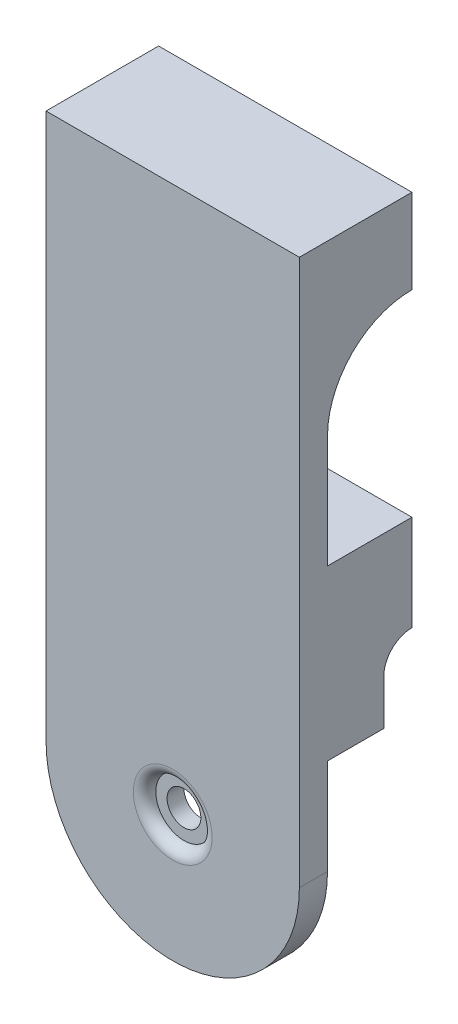
ISO-10303-21;
HEADER;
FILE_DESCRIPTION(('STEP AP214'),'2;1');
FILE_NAME('part.step','',(''),(''),'','','');
FILE_SCHEMA(('AUTOMOTIVE_DESIGN { 1 0 10303 214 1 1 1 1 }'));
ENDSEC;
DATA;
#1=APPLICATION_CONTEXT('core data for automotive mechanical design processes');
#2=APPLICATION_PROTOCOL_DEFINITION('international standard','automotive_design',2000,#1);
#3=PRODUCT_CONTEXT('',#1,'mechanical');
#4=PRODUCT('Part','Part','',(#3));
#5=PRODUCT_RELATED_PRODUCT_CATEGORY('part','',(#4));
#6=PRODUCT_DEFINITION_FORMATION('','',#4);
#7=PRODUCT_DEFINITION_CONTEXT('part definition',#1,'design');
#8=PRODUCT_DEFINITION('design','',#6,#7);
#9=PRODUCT_DEFINITION_SHAPE('','',#8);
#10=(LENGTH_UNIT() NAMED_UNIT(*) SI_UNIT(.MILLI.,.METRE.));
#11=(NAMED_UNIT(*) PLANE_ANGLE_UNIT() SI_UNIT($,.RADIAN.));
#12=(NAMED_UNIT(*) SI_UNIT($,.STERADIAN.) SOLID_ANGLE_UNIT());
#13=UNCERTAINTY_MEASURE_WITH_UNIT(LENGTH_MEASURE(1.E-05),#10,'distance_accuracy_value','');
#14=(GEOMETRIC_REPRESENTATION_CONTEXT(3) GLOBAL_UNCERTAINTY_ASSIGNED_CONTEXT((#13)) GLOBAL_UNIT_ASSIGNED_CONTEXT((#10,
#11,#12)) REPRESENTATION_CONTEXT('',''));
#15=CARTESIAN_POINT('',(0.,0.,0.));
#16=DIRECTION('',(0.,0.,1.));
#17=DIRECTION('',(1.,0.,0.));
#18=AXIS2_PLACEMENT_3D('',#15,#16,#17);
#19=CARTESIAN_POINT('',(-22.5,97.,0.));
#20=DIRECTION('',(0.,0.,1.));
#21=DIRECTION('',(1.,0.,0.));
#22=AXIS2_PLACEMENT_3D('',#19,#20,#21);
#23=PLANE('',#22);
#24=DIRECTION('',(0.,-1.,0.));
#25=VECTOR('',#24,1.);
#26=CARTESIAN_POINT('',(-22.5,97.,0.));
#27=LINE('',#26,#25);
#28=CARTESIAN_POINT('',(-22.5,67.,0.));
#29=VERTEX_POINT('',#28);
#30=CARTESIAN_POINT('',(-22.5,47.,0.));
#31=VERTEX_POINT('',#30);
#32=EDGE_CURVE('E239',#29,#31,#27,.T.);
#33=ORIENTED_EDGE('',*,*,#32,.F.);
#34=DIRECTION('',(-1.,0.,0.));
#35=VECTOR('',#34,1.);
#36=CARTESIAN_POINT('',(22.5,67.,0.));
#37=LINE('',#36,#35);
#38=CARTESIAN_POINT('',(22.5,67.,0.));
#39=VERTEX_POINT('',#38);
#40=EDGE_CURVE('E61',#29,#39,#37,.F.);
#41=ORIENTED_EDGE('',*,*,#40,.T.);
#42=DIRECTION('',(0.,-1.,0.));
#43=VECTOR('',#42,1.);
#44=CARTESIAN_POINT('',(22.5,97.,0.));
#45=LINE('',#44,#43);
#46=CARTESIAN_POINT('',(22.5,47.,0.));
#47=VERTEX_POINT('',#46);
#48=EDGE_CURVE('E243',#39,#47,#45,.T.);
#49=ORIENTED_EDGE('',*,*,#48,.T.);
#50=DIRECTION('',(-1.,0.,0.));
#51=VECTOR('',#50,1.);
#52=CARTESIAN_POINT('',(-22.5,47.,0.));
#53=LINE('',#52,#51);
#54=EDGE_CURVE('E230',#47,#31,#53,.T.);
#55=ORIENTED_EDGE('',*,*,#54,.T.);
#56=EDGE_LOOP('',(#33,#41,#49,#55));
#57=FACE_BOUND('',#56,.T.);
#58=ADVANCED_FACE('F39',(#57),#23,.F.);
#59=CARTESIAN_POINT('',(0.,47.,0.));
#60=DIRECTION('',(0.,-1.,0.));
#61=DIRECTION('',(0.,0.,-1.));
#62=AXIS2_PLACEMENT_3D('',#59,#60,#61);
#63=PLANE('',#62);
#64=ORIENTED_EDGE('',*,*,#54,.F.);
#65=DIRECTION('',(0.,0.,-1.));
#66=VECTOR('',#65,1.);
#67=CARTESIAN_POINT('',(22.5,47.,-15.));
#68=LINE('',#67,#66);
#69=CARTESIAN_POINT('',(22.5,47.,-15.));
#70=VERTEX_POINT('',#69);
#71=EDGE_CURVE('E279',#47,#70,#68,.T.);
#72=ORIENTED_EDGE('',*,*,#71,.T.);
#73=DIRECTION('',(-1.,0.,0.));
#74=VECTOR('',#73,1.);
#75=CARTESIAN_POINT('',(-22.5,47.,-15.));
#76=LINE('',#75,#74);
#77=CARTESIAN_POINT('',(-22.5,47.,-15.));
#78=VERTEX_POINT('',#77);
#79=EDGE_CURVE('E281',#70,#78,#76,.T.);
#80=ORIENTED_EDGE('',*,*,#79,.T.);
#81=DIRECTION('',(0.,0.,1.));
#82=VECTOR('',#81,1.);
#83=CARTESIAN_POINT('',(-22.5,47.,5.));
#84=LINE('',#83,#82);
#85=EDGE_CURVE('E283',#78,#31,#84,.T.);
#86=ORIENTED_EDGE('',*,*,#85,.T.);
#87=EDGE_LOOP('',(#64,#72,#80,#86));
#88=FACE_BOUND('',#87,.T.);
#89=ADVANCED_FACE('F371',(#88),#63,.F.);
#90=CARTESIAN_POINT('',(-22.5,47.,-15.));
#91=DIRECTION('',(0.,0.,1.));
#92=DIRECTION('',(1.,0.,0.));
#93=AXIS2_PLACEMENT_3D('',#90,#91,#92);
#94=PLANE('',#93);
#95=DIRECTION('',(-1.,0.,0.));
#96=VECTOR('',#95,1.);
#97=CARTESIAN_POINT('',(-22.5,30.,-15.));
#98=LINE('',#97,#96);
#99=CARTESIAN_POINT('',(22.5,30.,-15.));
#100=VERTEX_POINT('',#99);
#101=CARTESIAN_POINT('',(-22.5,30.,-15.));
#102=VERTEX_POINT('',#101);
#103=EDGE_CURVE('E278',#100,#102,#98,.T.);
#104=ORIENTED_EDGE('',*,*,#103,.T.);
#105=DIRECTION('',(0.,-1.,0.));
#106=VECTOR('',#105,1.);
#107=CARTESIAN_POINT('',(-22.5,47.,-15.));
#108=LINE('',#107,#106);
#109=EDGE_CURVE('E286',#78,#102,#108,.T.);
#110=ORIENTED_EDGE('',*,*,#109,.F.);
#111=ORIENTED_EDGE('',*,*,#79,.F.);
#112=DIRECTION('',(0.,-1.,0.));
#113=VECTOR('',#112,1.);
#114=CARTESIAN_POINT('',(22.5,47.,-15.));
#115=LINE('',#114,#113);
#116=EDGE_CURVE('E290',#70,#100,#115,.T.);
#117=ORIENTED_EDGE('',*,*,#116,.T.);
#118=EDGE_LOOP('',(#104,#110,#111,#117));
#119=FACE_BOUND('',#118,.T.);
#120=DIRECTION('',(-1.,0.,0.));
#121=VECTOR('',#120,1.);
#122=CARTESIAN_POINT('',(15.25,41.75,-15.));
#123=LINE('',#122,#121);
#124=CARTESIAN_POINT('',(15.25,41.75,-15.));
#125=VERTEX_POINT('',#124);
#126=CARTESIAN_POINT('',(-15.25,41.75,-15.));
#127=VERTEX_POINT('',#126);
#128=EDGE_CURVE('E245',#125,#127,#123,.T.);
#129=ORIENTED_EDGE('',*,*,#128,.T.);
#130=DIRECTION('',(0.,-1.,0.));
#131=VECTOR('',#130,1.);
#132=CARTESIAN_POINT('',(-15.25,41.75,-15.));
#133=LINE('',#132,#131);
#134=CARTESIAN_POINT('',(-15.25,35.25,-15.));
#135=VERTEX_POINT('',#134);
#136=EDGE_CURVE('E261',#127,#135,#133,.T.);
#137=ORIENTED_EDGE('',*,*,#136,.T.);
#138=DIRECTION('',(-1.,0.,0.));
#139=VECTOR('',#138,1.);
#140=CARTESIAN_POINT('',(15.25,35.25,-15.));
#141=LINE('',#140,#139);
#142=CARTESIAN_POINT('',(15.25,35.25,-15.));
#143=VERTEX_POINT('',#142);
#144=EDGE_CURVE('E264',#143,#135,#141,.T.);
#145=ORIENTED_EDGE('',*,*,#144,.F.);
#146=DIRECTION('',(0.,-1.,0.));
#147=VECTOR('',#146,1.);
#148=CARTESIAN_POINT('',(15.25,41.75,-15.));
#149=LINE('',#148,#147);
#150=EDGE_CURVE('E250',#125,#143,#149,.T.);
#151=ORIENTED_EDGE('',*,*,#150,.F.);
#152=EDGE_LOOP('',(#129,#137,#145,#151));
#153=FACE_BOUND('',#152,.T.);
#154=ADVANCED_FACE('F377',(#119,#153),#94,.F.);
#155=CARTESIAN_POINT('',(0.,0.,0.));
#156=DIRECTION('',(0.,0.,1.));
#157=DIRECTION('',(1.,0.,0.));
#158=AXIS2_PLACEMENT_3D('',#155,#156,#157);
#159=PLANE('',#158);
#160=CARTESIAN_POINT('',(0.,0.,0.));
#161=DIRECTION('',(0.,0.,1.));
#162=DIRECTION('',(1.,0.,0.));
#163=AXIS2_PLACEMENT_3D('',#160,#161,#162);
#164=CIRCLE('',#163,3.);
#165=CARTESIAN_POINT('',(3.,0.,0.));
#166=VERTEX_POINT('',#165);
#167=EDGE_CURVE('E313',#166,#166,#164,.T.);
#168=ORIENTED_EDGE('',*,*,#167,.T.);
#169=EDGE_LOOP('',(#168));
#170=FACE_BOUND('',#169,.T.);
#171=DIRECTION('',(-1.,0.,0.));
#172=VECTOR('',#171,1.);
#173=CARTESIAN_POINT('',(22.5,17.,0.));
#174=LINE('',#173,#172);
#175=CARTESIAN_POINT('',(22.5,17.,0.));
#176=VERTEX_POINT('',#175);
#177=CARTESIAN_POINT('',(-22.5,17.,0.));
#178=VERTEX_POINT('',#177);
#179=EDGE_CURVE('E293',#176,#178,#174,.T.);
#180=ORIENTED_EDGE('',*,*,#179,.F.);
#181=DIRECTION('',(0.,1.,0.));
#182=VECTOR('',#181,1.);
#183=CARTESIAN_POINT('',(22.5,30.,0.));
#184=LINE('',#183,#182);
#185=CARTESIAN_POINT('',(22.5,0.,0.));
#186=VERTEX_POINT('',#185);
#187=EDGE_CURVE('E328',#186,#176,#184,.T.);
#188=ORIENTED_EDGE('',*,*,#187,.F.);
#189=CARTESIAN_POINT('',(0.,0.,0.));
#190=DIRECTION('',(0.,0.,1.));
#191=DIRECTION('',(1.,0.,0.));
#192=AXIS2_PLACEMENT_3D('',#189,#190,#191);
#193=CIRCLE('',#192,22.5);
#194=CARTESIAN_POINT('',(-22.5,0.,0.));
#195=VERTEX_POINT('',#194);
#196=EDGE_CURVE('E316',#195,#186,#193,.T.);
#197=ORIENTED_EDGE('',*,*,#196,.F.);
#198=DIRECTION('',(0.,-1.,0.));
#199=VECTOR('',#198,1.);
#200=CARTESIAN_POINT('',(-22.5,0.,0.));
#201=LINE('',#200,#199);
#202=EDGE_CURVE('E321',#178,#195,#201,.T.);
#203=ORIENTED_EDGE('',*,*,#202,.F.);
#204=EDGE_LOOP('',(#180,#188,#197,#203));
#205=FACE_BOUND('',#204,.T.);
#206=ADVANCED_FACE('F407',(#170,#205),#159,.F.);
#207=CARTESIAN_POINT('',(0.,0.,5.));
#208=DIRECTION('',(0.,0.,-1.));
#209=DIRECTION('',(-1.,0.,0.));
#210=AXIS2_PLACEMENT_3D('',#207,#208,#209);
#211=CYLINDRICAL_SURFACE('',#210,3.);
#212=ORIENTED_EDGE('',*,*,#167,.F.);
#213=EDGE_LOOP('',(#212));
#214=FACE_BOUND('',#213,.T.);
#215=CARTESIAN_POINT('',(0.,0.,3.));
#216=DIRECTION('',(0.,0.,1.));
#217=DIRECTION('',(1.,0.,0.));
#218=AXIS2_PLACEMENT_3D('',#215,#216,#217);
#219=CIRCLE('',#218,3.);
#220=CARTESIAN_POINT('',(3.,0.,3.));
#221=VERTEX_POINT('',#220);
#222=EDGE_CURVE('E312',#221,#221,#219,.T.);
#223=ORIENTED_EDGE('',*,*,#222,.T.);
#224=EDGE_LOOP('',(#223));
#225=FACE_BOUND('',#224,.T.);
#226=ADVANCED_FACE('F421',(#214,#225),#211,.F.);
#227=CARTESIAN_POINT('',(0.,0.,5.));
#228=DIRECTION('',(0.,0.,1.));
#229=DIRECTION('',(1.,0.,0.));
#230=AXIS2_PLACEMENT_3D('',#227,#228,#229);
#231=PLANE('',#230);
#232=CARTESIAN_POINT('',(0.,0.,5.));
#233=DIRECTION('',(0.,0.,1.));
#234=DIRECTION('',(1.,0.,0.));
#235=AXIS2_PLACEMENT_3D('',#232,#233,#234);
#236=CIRCLE('',#235,7.);
#237=CARTESIAN_POINT('',(7.,0.,5.));
#238=VERTEX_POINT('',#237);
#239=EDGE_CURVE('E11',#238,#238,#236,.F.);
#240=ORIENTED_EDGE('',*,*,#239,.T.);
#241=EDGE_LOOP('',(#240));
#242=FACE_BOUND('',#241,.T.);
#243=CARTESIAN_POINT('',(0.,0.,5.));
#244=DIRECTION('',(0.,0.,1.));
#245=DIRECTION('',(1.,0.,0.));
#246=AXIS2_PLACEMENT_3D('',#243,#244,#245);
#247=CIRCLE('',#246,22.5);
#248=CARTESIAN_POINT('',(-22.5,0.,5.));
#249=VERTEX_POINT('',#248);
#250=CARTESIAN_POINT('',(22.5,0.,5.));
#251=VERTEX_POINT('',#250);
#252=EDGE_CURVE('E317',#249,#251,#247,.T.);
#253=ORIENTED_EDGE('',*,*,#252,.T.);
#254=DIRECTION('',(0.,1.,0.));
#255=VECTOR('',#254,1.);
#256=CARTESIAN_POINT('',(22.5,30.,5.));
#257=LINE('',#256,#255);
#258=CARTESIAN_POINT('',(22.5,97.,5.));
#259=VERTEX_POINT('',#258);
#260=EDGE_CURVE('E320',#251,#259,#257,.T.);
#261=ORIENTED_EDGE('',*,*,#260,.T.);
#262=DIRECTION('',(1.,0.,0.));
#263=VECTOR('',#262,1.);
#264=CARTESIAN_POINT('',(-22.5,97.,5.));
#265=LINE('',#264,#263);
#266=CARTESIAN_POINT('',(-22.5,97.,5.));
#267=VERTEX_POINT('',#266);
#268=EDGE_CURVE('E234',#267,#259,#265,.T.);
#269=ORIENTED_EDGE('',*,*,#268,.F.);
#270=DIRECTION('',(0.,-1.,0.));
#271=VECTOR('',#270,1.);
#272=CARTESIAN_POINT('',(-22.5,0.,5.));
#273=LINE('',#272,#271);
#274=EDGE_CURVE('E323',#267,#249,#273,.T.);
#275=ORIENTED_EDGE('',*,*,#274,.T.);
#276=EDGE_LOOP('',(#253,#261,#269,#275));
#277=FACE_BOUND('',#276,.T.);
#278=ADVANCED_FACE('F424',(#242,#277),#231,.T.);
#279=CARTESIAN_POINT('',(0.,0.,5.));
#280=DIRECTION('',(0.,0.,-1.));
#281=DIRECTION('',(-1.,0.,0.));
#282=AXIS2_PLACEMENT_3D('',#279,#280,#281);
#283=CYLINDRICAL_SURFACE('',#282,22.5);
#284=ORIENTED_EDGE('',*,*,#196,.T.);
#285=DIRECTION('',(0.,0.,-1.));
#286=VECTOR('',#285,1.);
#287=CARTESIAN_POINT('',(22.5,0.,5.));
#288=LINE('',#287,#286);
#289=EDGE_CURVE('E334',#251,#186,#288,.T.);
#290=ORIENTED_EDGE('',*,*,#289,.F.);
#291=ORIENTED_EDGE('',*,*,#252,.F.);
#292=DIRECTION('',(0.,0.,-1.));
#293=VECTOR('',#292,1.);
#294=CARTESIAN_POINT('',(-22.5,0.,5.));
#295=LINE('',#294,#293);
#296=EDGE_CURVE('E325',#249,#195,#295,.T.);
#297=ORIENTED_EDGE('',*,*,#296,.T.);
#298=EDGE_LOOP('',(#284,#290,#291,#297));
#299=FACE_BOUND('',#298,.T.);
#300=ADVANCED_FACE('F427',(#299),#283,.T.);
#301=CARTESIAN_POINT('',(22.5,30.,5.));
#302=DIRECTION('',(-1.,0.,0.));
#303=DIRECTION('',(0.,-1.,0.));
#304=AXIS2_PLACEMENT_3D('',#301,#302,#303);
#305=PLANE('',#304);
#306=ORIENTED_EDGE('',*,*,#187,.T.);
#307=DIRECTION('',(0.,0.,1.));
#308=VECTOR('',#307,1.);
#309=CARTESIAN_POINT('',(22.5,17.,-10.));
#310=LINE('',#309,#308);
#311=CARTESIAN_POINT('',(22.5,17.,-10.));
#312=VERTEX_POINT('',#311);
#313=EDGE_CURVE('E306',#312,#176,#310,.T.);
#314=ORIENTED_EDGE('',*,*,#313,.F.);
#315=DIRECTION('',(0.,-1.,0.));
#316=VECTOR('',#315,1.);
#317=CARTESIAN_POINT('',(22.5,30.,-10.));
#318=LINE('',#317,#316);
#319=CARTESIAN_POINT('',(22.5,25.,-10.));
#320=VERTEX_POINT('',#319);
#321=EDGE_CURVE('E294',#320,#312,#318,.T.);
#322=ORIENTED_EDGE('',*,*,#321,.F.);
#323=CARTESIAN_POINT('',(22.5,25.,-15.));
#324=DIRECTION('',(-1.,0.,0.));
#325=DIRECTION('',(0.,-1.,0.));
#326=AXIS2_PLACEMENT_3D('',#323,#324,#325);
#327=CIRCLE('',#326,5.);
#328=EDGE_CURVE('E342',#320,#100,#327,.T.);
#329=ORIENTED_EDGE('',*,*,#328,.T.);
#330=ORIENTED_EDGE('',*,*,#116,.F.);
#331=ORIENTED_EDGE('',*,*,#71,.F.);
#332=ORIENTED_EDGE('',*,*,#48,.F.);
#333=CARTESIAN_POINT('',(22.5,67.,-15.));
#334=DIRECTION('',(-1.,0.,0.));
#335=DIRECTION('',(0.,-1.,0.));
#336=AXIS2_PLACEMENT_3D('',#333,#334,#335);
#337=CIRCLE('',#336,15.);
#338=CARTESIAN_POINT('',(22.5,82.,-15.));
#339=VERTEX_POINT('',#338);
#340=EDGE_CURVE('E47',#39,#339,#337,.T.);
#341=ORIENTED_EDGE('',*,*,#340,.T.);
#342=DIRECTION('',(0.,-1.,0.));
#343=VECTOR('',#342,1.);
#344=CARTESIAN_POINT('',(22.5,97.,-15.));
#345=LINE('',#344,#343);
#346=CARTESIAN_POINT('',(22.5,97.,-15.));
#347=VERTEX_POINT('',#346);
#348=EDGE_CURVE('E215',#347,#339,#345,.T.);
#349=ORIENTED_EDGE('',*,*,#348,.F.);
#350=DIRECTION('',(0.,0.,-1.));
#351=VECTOR('',#350,1.);
#352=CARTESIAN_POINT('',(22.5,97.,5.));
#353=LINE('',#352,#351);
#354=EDGE_CURVE('E237',#259,#347,#353,.T.);
#355=ORIENTED_EDGE('',*,*,#354,.F.);
#356=ORIENTED_EDGE('',*,*,#260,.F.);
#357=ORIENTED_EDGE('',*,*,#289,.T.);
#358=EDGE_LOOP('',(#306,#314,#322,#329,#330,#331,#332,#341,#349,#355,#356,#357));
#359=FACE_BOUND('',#358,.T.);
#360=ADVANCED_FACE('F350',(#359),#305,.F.);
#361=CARTESIAN_POINT('',(-22.5,0.,5.));
#362=DIRECTION('',(1.,0.,0.));
#363=DIRECTION('',(0.,0.,-1.));
#364=AXIS2_PLACEMENT_3D('',#361,#362,#363);
#365=PLANE('',#364);
#366=ORIENTED_EDGE('',*,*,#274,.F.);
#367=DIRECTION('',(0.,0.,1.));
#368=VECTOR('',#367,1.);
#369=CARTESIAN_POINT('',(-22.5,97.,5.));
#370=LINE('',#369,#368);
#371=CARTESIAN_POINT('',(-22.5,97.,-15.));
#372=VERTEX_POINT('',#371);
#373=EDGE_CURVE('E231',#372,#267,#370,.T.);
#374=ORIENTED_EDGE('',*,*,#373,.F.);
#375=DIRECTION('',(0.,1.,0.));
#376=VECTOR('',#375,1.);
#377=CARTESIAN_POINT('',(-22.5,97.,-15.));
#378=LINE('',#377,#376);
#379=CARTESIAN_POINT('',(-22.5,82.,-15.));
#380=VERTEX_POINT('',#379);
#381=EDGE_CURVE('E224',#380,#372,#378,.T.);
#382=ORIENTED_EDGE('',*,*,#381,.F.);
#383=CARTESIAN_POINT('',(-22.5,67.,-15.));
#384=DIRECTION('',(1.,0.,0.));
#385=DIRECTION('',(0.,0.,-1.));
#386=AXIS2_PLACEMENT_3D('',#383,#384,#385);
#387=CIRCLE('',#386,15.);
#388=EDGE_CURVE('E54',#380,#29,#387,.T.);
#389=ORIENTED_EDGE('',*,*,#388,.T.);
#390=ORIENTED_EDGE('',*,*,#32,.T.);
#391=ORIENTED_EDGE('',*,*,#85,.F.);
#392=ORIENTED_EDGE('',*,*,#109,.T.);
#393=CARTESIAN_POINT('',(-22.5,25.,-15.));
#394=DIRECTION('',(1.,0.,0.));
#395=DIRECTION('',(0.,0.,-1.));
#396=AXIS2_PLACEMENT_3D('',#393,#394,#395);
#397=CIRCLE('',#396,5.);
#398=CARTESIAN_POINT('',(-22.5,25.,-10.));
#399=VERTEX_POINT('',#398);
#400=EDGE_CURVE('E344',#102,#399,#397,.T.);
#401=ORIENTED_EDGE('',*,*,#400,.T.);
#402=DIRECTION('',(0.,1.,0.));
#403=VECTOR('',#402,1.);
#404=CARTESIAN_POINT('',(-22.5,17.,-10.));
#405=LINE('',#404,#403);
#406=CARTESIAN_POINT('',(-22.5,17.,-10.));
#407=VERTEX_POINT('',#406);
#408=EDGE_CURVE('E298',#407,#399,#405,.T.);
#409=ORIENTED_EDGE('',*,*,#408,.F.);
#410=DIRECTION('',(0.,0.,1.));
#411=VECTOR('',#410,1.);
#412=CARTESIAN_POINT('',(-22.5,17.,-10.));
#413=LINE('',#412,#411);
#414=EDGE_CURVE('E301',#407,#178,#413,.T.);
#415=ORIENTED_EDGE('',*,*,#414,.T.);
#416=ORIENTED_EDGE('',*,*,#202,.T.);
#417=ORIENTED_EDGE('',*,*,#296,.F.);
#418=EDGE_LOOP('',(#366,#374,#382,#389,#390,#391,#392,#401,#409,#415,#416,#417));
#419=FACE_BOUND('',#418,.T.);
#420=ADVANCED_FACE('F419',(#419),#365,.F.);
#421=CARTESIAN_POINT('',(0.,0.,3.));
#422=DIRECTION('',(0.,0.,1.));
#423=DIRECTION('',(1.,0.,0.));
#424=AXIS2_PLACEMENT_3D('',#421,#422,#423);
#425=PLANE('',#424);
#426=ORIENTED_EDGE('',*,*,#222,.F.);
#427=EDGE_LOOP('',(#426));
#428=FACE_BOUND('',#427,.T.);
#429=CARTESIAN_POINT('',(0.,0.,3.));
#430=DIRECTION('',(0.,0.,1.));
#431=DIRECTION('',(1.,0.,0.));
#432=AXIS2_PLACEMENT_3D('',#429,#430,#431);
#433=CIRCLE('',#432,5.);
#434=CARTESIAN_POINT('',(5.,0.,3.));
#435=VERTEX_POINT('',#434);
#436=EDGE_CURVE('E309',#435,#435,#433,.T.);
#437=ORIENTED_EDGE('',*,*,#436,.T.);
#438=EDGE_LOOP('',(#437));
#439=FACE_BOUND('',#438,.T.);
#440=ADVANCED_FACE('F415',(#428,#439),#425,.T.);
#441=CARTESIAN_POINT('',(22.5,17.,-10.));
#442=DIRECTION('',(0.,1.,0.));
#443=DIRECTION('',(0.,0.,1.));
#444=AXIS2_PLACEMENT_3D('',#441,#442,#443);
#445=PLANE('',#444);
#446=ORIENTED_EDGE('',*,*,#179,.T.);
#447=ORIENTED_EDGE('',*,*,#414,.F.);
#448=DIRECTION('',(-1.,0.,0.));
#449=VECTOR('',#448,1.);
#450=CARTESIAN_POINT('',(22.5,17.,-10.));
#451=LINE('',#450,#449);
#452=EDGE_CURVE('E296',#312,#407,#451,.T.);
#453=ORIENTED_EDGE('',*,*,#452,.F.);
#454=ORIENTED_EDGE('',*,*,#313,.T.);
#455=EDGE_LOOP('',(#446,#447,#453,#454));
#456=FACE_BOUND('',#455,.T.);
#457=ADVANCED_FACE('F411',(#456),#445,.F.);
#458=CARTESIAN_POINT('',(0.,0.,-10.));
#459=DIRECTION('',(0.,0.,-1.));
#460=DIRECTION('',(-1.,0.,0.));
#461=AXIS2_PLACEMENT_3D('',#458,#459,#460);
#462=PLANE('',#461);
#463=ORIENTED_EDGE('',*,*,#408,.T.);
#464=DIRECTION('',(1.,0.,0.));
#465=VECTOR('',#464,1.);
#466=CARTESIAN_POINT('',(22.5,25.,-10.));
#467=LINE('',#466,#465);
#468=EDGE_CURVE('E337',#399,#320,#467,.T.);
#469=ORIENTED_EDGE('',*,*,#468,.T.);
#470=ORIENTED_EDGE('',*,*,#321,.T.);
#471=ORIENTED_EDGE('',*,*,#452,.T.);
#472=EDGE_LOOP('',(#463,#469,#470,#471));
#473=FACE_BOUND('',#472,.T.);
#474=ADVANCED_FACE('F402',(#473),#462,.T.);
#475=CARTESIAN_POINT('',(15.25,41.75,0.));
#476=DIRECTION('',(0.,-1.,0.));
#477=DIRECTION('',(1.,0.,0.));
#478=AXIS2_PLACEMENT_3D('',#475,#476,#477);
#479=PLANE('',#478);
#480=ORIENTED_EDGE('',*,*,#128,.F.);
#481=DIRECTION('',(0.,0.,-1.));
#482=VECTOR('',#481,1.);
#483=CARTESIAN_POINT('',(15.25,41.75,0.));
#484=LINE('',#483,#482);
#485=CARTESIAN_POINT('',(15.25,41.75,0.));
#486=VERTEX_POINT('',#485);
#487=EDGE_CURVE('E258',#486,#125,#484,.T.);
#488=ORIENTED_EDGE('',*,*,#487,.F.);
#489=DIRECTION('',(-1.,0.,0.));
#490=VECTOR('',#489,1.);
#491=CARTESIAN_POINT('',(15.25,41.75,0.));
#492=LINE('',#491,#490);
#493=CARTESIAN_POINT('',(-15.25,41.75,0.));
#494=VERTEX_POINT('',#493);
#495=EDGE_CURVE('E246',#486,#494,#492,.T.);
#496=ORIENTED_EDGE('',*,*,#495,.T.);
#497=DIRECTION('',(0.,0.,-1.));
#498=VECTOR('',#497,1.);
#499=CARTESIAN_POINT('',(-15.25,41.75,0.));
#500=LINE('',#499,#498);
#501=EDGE_CURVE('E275',#494,#127,#500,.T.);
#502=ORIENTED_EDGE('',*,*,#501,.T.);
#503=EDGE_LOOP('',(#480,#488,#496,#502));
#504=FACE_BOUND('',#503,.T.);
#505=ADVANCED_FACE('F399',(#504),#479,.T.);
#506=CARTESIAN_POINT('',(-15.25,41.75,0.));
#507=DIRECTION('',(1.,0.,0.));
#508=DIRECTION('',(0.,0.,-1.));
#509=AXIS2_PLACEMENT_3D('',#506,#507,#508);
#510=PLANE('',#509);
#511=ORIENTED_EDGE('',*,*,#136,.F.);
#512=ORIENTED_EDGE('',*,*,#501,.F.);
#513=DIRECTION('',(0.,-1.,0.));
#514=VECTOR('',#513,1.);
#515=CARTESIAN_POINT('',(-15.25,41.75,0.));
#516=LINE('',#515,#514);
#517=CARTESIAN_POINT('',(-15.25,35.25,0.));
#518=VERTEX_POINT('',#517);
#519=EDGE_CURVE('E249',#494,#518,#516,.T.);
#520=ORIENTED_EDGE('',*,*,#519,.T.);
#521=DIRECTION('',(0.,0.,-1.));
#522=VECTOR('',#521,1.);
#523=CARTESIAN_POINT('',(-15.25,35.25,0.));
#524=LINE('',#523,#522);
#525=EDGE_CURVE('E273',#518,#135,#524,.T.);
#526=ORIENTED_EDGE('',*,*,#525,.T.);
#527=EDGE_LOOP('',(#511,#512,#520,#526));
#528=FACE_BOUND('',#527,.T.);
#529=ADVANCED_FACE('F395',(#528),#510,.T.);
#530=CARTESIAN_POINT('',(15.25,35.25,0.));
#531=DIRECTION('',(0.,-1.,0.));
#532=DIRECTION('',(0.,0.,-1.));
#533=AXIS2_PLACEMENT_3D('',#530,#531,#532);
#534=PLANE('',#533);
#535=ORIENTED_EDGE('',*,*,#144,.T.);
#536=ORIENTED_EDGE('',*,*,#525,.F.);
#537=DIRECTION('',(-1.,0.,0.));
#538=VECTOR('',#537,1.);
#539=CARTESIAN_POINT('',(15.25,35.25,0.));
#540=LINE('',#539,#538);
#541=CARTESIAN_POINT('',(15.25,35.25,0.));
#542=VERTEX_POINT('',#541);
#543=EDGE_CURVE('E252',#542,#518,#540,.T.);
#544=ORIENTED_EDGE('',*,*,#543,.F.);
#545=DIRECTION('',(0.,0.,-1.));
#546=VECTOR('',#545,1.);
#547=CARTESIAN_POINT('',(15.25,35.25,0.));
#548=LINE('',#547,#546);
#549=EDGE_CURVE('E271',#542,#143,#548,.T.);
#550=ORIENTED_EDGE('',*,*,#549,.T.);
#551=EDGE_LOOP('',(#535,#536,#544,#550));
#552=FACE_BOUND('',#551,.T.);
#553=ADVANCED_FACE('F391',(#552),#534,.F.);
#554=CARTESIAN_POINT('',(15.25,41.75,0.));
#555=DIRECTION('',(1.,0.,0.));
#556=DIRECTION('',(0.,0.,-1.));
#557=AXIS2_PLACEMENT_3D('',#554,#555,#556);
#558=PLANE('',#557);
#559=ORIENTED_EDGE('',*,*,#150,.T.);
#560=ORIENTED_EDGE('',*,*,#549,.F.);
#561=DIRECTION('',(0.,-1.,0.));
#562=VECTOR('',#561,1.);
#563=CARTESIAN_POINT('',(15.25,41.75,0.));
#564=LINE('',#563,#562);
#565=EDGE_CURVE('E255',#486,#542,#564,.T.);
#566=ORIENTED_EDGE('',*,*,#565,.F.);
#567=ORIENTED_EDGE('',*,*,#487,.T.);
#568=EDGE_LOOP('',(#559,#560,#566,#567));
#569=FACE_BOUND('',#568,.T.);
#570=ADVANCED_FACE('F387',(#569),#558,.F.);
#571=CARTESIAN_POINT('',(0.,0.,0.));
#572=DIRECTION('',(0.,0.,1.));
#573=DIRECTION('',(1.,0.,0.));
#574=AXIS2_PLACEMENT_3D('',#571,#572,#573);
#575=PLANE('',#574);
#576=ORIENTED_EDGE('',*,*,#495,.F.);
#577=ORIENTED_EDGE('',*,*,#565,.T.);
#578=ORIENTED_EDGE('',*,*,#543,.T.);
#579=ORIENTED_EDGE('',*,*,#519,.F.);
#580=EDGE_LOOP('',(#576,#577,#578,#579));
#581=FACE_BOUND('',#580,.T.);
#582=ADVANCED_FACE('F384',(#581),#575,.F.);
#583=CARTESIAN_POINT('',(0.,97.,0.));
#584=DIRECTION('',(0.,-1.,0.));
#585=DIRECTION('',(0.,0.,-1.));
#586=AXIS2_PLACEMENT_3D('',#583,#584,#585);
#587=PLANE('',#586);
#588=ORIENTED_EDGE('',*,*,#373,.T.);
#589=ORIENTED_EDGE('',*,*,#268,.T.);
#590=ORIENTED_EDGE('',*,*,#354,.T.);
#591=DIRECTION('',(1.,0.,0.));
#592=VECTOR('',#591,1.);
#593=CARTESIAN_POINT('',(22.5,97.,-15.));
#594=LINE('',#593,#592);
#595=EDGE_CURVE('E227',#372,#347,#594,.T.);
#596=ORIENTED_EDGE('',*,*,#595,.F.);
#597=EDGE_LOOP('',(#588,#589,#590,#596));
#598=FACE_BOUND('',#597,.T.);
#599=ADVANCED_FACE('F382',(#598),#587,.F.);
#600=CARTESIAN_POINT('',(0.,0.,-15.));
#601=DIRECTION('',(0.,0.,-1.));
#602=DIRECTION('',(-1.,0.,0.));
#603=AXIS2_PLACEMENT_3D('',#600,#601,#602);
#604=PLANE('',#603);
#605=DIRECTION('',(0.,-1.,0.));
#606=VECTOR('',#605,1.);
#607=CARTESIAN_POINT('',(17.75,86.75,-15.));
#608=LINE('',#607,#606);
#609=CARTESIAN_POINT('',(17.75,92.25,-15.));
#610=VERTEX_POINT('',#609);
#611=CARTESIAN_POINT('',(17.75,86.75,-15.));
#612=VERTEX_POINT('',#611);
#613=EDGE_CURVE('E183',#610,#612,#608,.T.);
#614=ORIENTED_EDGE('',*,*,#613,.F.);
#615=DIRECTION('',(1.,0.,0.));
#616=VECTOR('',#615,1.);
#617=CARTESIAN_POINT('',(17.75,92.25,-15.));
#618=LINE('',#617,#616);
#619=CARTESIAN_POINT('',(-17.75,92.25,-15.));
#620=VERTEX_POINT('',#619);
#621=EDGE_CURVE('E200',#620,#610,#618,.T.);
#622=ORIENTED_EDGE('',*,*,#621,.F.);
#623=DIRECTION('',(0.,1.,0.));
#624=VECTOR('',#623,1.);
#625=CARTESIAN_POINT('',(-17.75,86.75,-15.));
#626=LINE('',#625,#624);
#627=CARTESIAN_POINT('',(-17.75,86.75,-15.));
#628=VERTEX_POINT('',#627);
#629=EDGE_CURVE('E203',#628,#620,#626,.T.);
#630=ORIENTED_EDGE('',*,*,#629,.F.);
#631=DIRECTION('',(-1.,0.,0.));
#632=VECTOR('',#631,1.);
#633=CARTESIAN_POINT('',(17.75,86.75,-15.));
#634=LINE('',#633,#632);
#635=EDGE_CURVE('E209',#612,#628,#634,.T.);
#636=ORIENTED_EDGE('',*,*,#635,.F.);
#637=EDGE_LOOP('',(#614,#622,#630,#636));
#638=FACE_BOUND('',#637,.T.);
#639=ORIENTED_EDGE('',*,*,#348,.T.);
#640=DIRECTION('',(-1.,0.,0.));
#641=VECTOR('',#640,1.);
#642=CARTESIAN_POINT('',(22.5,82.,-15.));
#643=LINE('',#642,#641);
#644=EDGE_CURVE('E221',#339,#380,#643,.T.);
#645=ORIENTED_EDGE('',*,*,#644,.T.);
#646=ORIENTED_EDGE('',*,*,#381,.T.);
#647=ORIENTED_EDGE('',*,*,#595,.T.);
#648=EDGE_LOOP('',(#639,#645,#646,#647));
#649=FACE_BOUND('',#648,.T.);
#650=ADVANCED_FACE('F356',(#638,#649),#604,.T.);
#651=CARTESIAN_POINT('',(17.75,86.75,0.));
#652=DIRECTION('',(1.,0.,0.));
#653=DIRECTION('',(0.,0.,-1.));
#654=AXIS2_PLACEMENT_3D('',#651,#652,#653);
#655=PLANE('',#654);
#656=ORIENTED_EDGE('',*,*,#613,.T.);
#657=DIRECTION('',(0.,0.,-1.));
#658=VECTOR('',#657,1.);
#659=CARTESIAN_POINT('',(17.75,86.75,0.));
#660=LINE('',#659,#658);
#661=CARTESIAN_POINT('',(17.75,86.75,0.));
#662=VERTEX_POINT('',#661);
#663=EDGE_CURVE('E176',#662,#612,#660,.T.);
#664=ORIENTED_EDGE('',*,*,#663,.F.);
#665=DIRECTION('',(0.,-1.,0.));
#666=VECTOR('',#665,1.);
#667=CARTESIAN_POINT('',(17.75,86.75,0.));
#668=LINE('',#667,#666);
#669=CARTESIAN_POINT('',(17.75,92.25,0.));
#670=VERTEX_POINT('',#669);
#671=EDGE_CURVE('E180',#670,#662,#668,.T.);
#672=ORIENTED_EDGE('',*,*,#671,.F.);
#673=DIRECTION('',(0.,0.,-1.));
#674=VECTOR('',#673,1.);
#675=CARTESIAN_POINT('',(17.75,92.25,0.));
#676=LINE('',#675,#674);
#677=EDGE_CURVE('E213',#670,#610,#676,.T.);
#678=ORIENTED_EDGE('',*,*,#677,.T.);
#679=EDGE_LOOP('',(#656,#664,#672,#678));
#680=FACE_BOUND('',#679,.T.);
#681=ADVANCED_FACE('F178',(#680),#655,.F.);
#682=CARTESIAN_POINT('',(17.75,92.25,0.));
#683=DIRECTION('',(0.,1.,0.));
#684=DIRECTION('',(0.,0.,1.));
#685=AXIS2_PLACEMENT_3D('',#682,#683,#684);
#686=PLANE('',#685);
#687=ORIENTED_EDGE('',*,*,#621,.T.);
#688=ORIENTED_EDGE('',*,*,#677,.F.);
#689=DIRECTION('',(1.,0.,0.));
#690=VECTOR('',#689,1.);
#691=CARTESIAN_POINT('',(17.75,92.25,0.));
#692=LINE('',#691,#690);
#693=CARTESIAN_POINT('',(-17.75,92.25,0.));
#694=VERTEX_POINT('',#693);
#695=EDGE_CURVE('E188',#694,#670,#692,.T.);
#696=ORIENTED_EDGE('',*,*,#695,.F.);
#697=DIRECTION('',(0.,0.,-1.));
#698=VECTOR('',#697,1.);
#699=CARTESIAN_POINT('',(-17.75,92.25,0.));
#700=LINE('',#699,#698);
#701=EDGE_CURVE('E216',#694,#620,#700,.T.);
#702=ORIENTED_EDGE('',*,*,#701,.T.);
#703=EDGE_LOOP('',(#687,#688,#696,#702));
#704=FACE_BOUND('',#703,.T.);
#705=ADVANCED_FACE('F475',(#704),#686,.F.);
#706=CARTESIAN_POINT('',(-17.75,86.75,0.));
#707=DIRECTION('',(-1.,0.,0.));
#708=DIRECTION('',(0.,0.,1.));
#709=AXIS2_PLACEMENT_3D('',#706,#707,#708);
#710=PLANE('',#709);
#711=ORIENTED_EDGE('',*,*,#629,.T.);
#712=ORIENTED_EDGE('',*,*,#701,.F.);
#713=DIRECTION('',(0.,1.,0.));
#714=VECTOR('',#713,1.);
#715=CARTESIAN_POINT('',(-17.75,86.75,0.));
#716=LINE('',#715,#714);
#717=CARTESIAN_POINT('',(-17.75,86.75,0.));
#718=VERTEX_POINT('',#717);
#719=EDGE_CURVE('E196',#718,#694,#716,.T.);
#720=ORIENTED_EDGE('',*,*,#719,.F.);
#721=DIRECTION('',(0.,0.,-1.));
#722=VECTOR('',#721,1.);
#723=CARTESIAN_POINT('',(-17.75,86.75,0.));
#724=LINE('',#723,#722);
#725=EDGE_CURVE('E187',#718,#628,#724,.T.);
#726=ORIENTED_EDGE('',*,*,#725,.T.);
#727=EDGE_LOOP('',(#711,#712,#720,#726));
#728=FACE_BOUND('',#727,.T.);
#729=ADVANCED_FACE('F480',(#728),#710,.F.);
#730=CARTESIAN_POINT('',(17.75,86.75,0.));
#731=DIRECTION('',(0.,-1.,0.));
#732=DIRECTION('',(0.,0.,-1.));
#733=AXIS2_PLACEMENT_3D('',#730,#731,#732);
#734=PLANE('',#733);
#735=ORIENTED_EDGE('',*,*,#635,.T.);
#736=ORIENTED_EDGE('',*,*,#725,.F.);
#737=DIRECTION('',(-1.,0.,0.));
#738=VECTOR('',#737,1.);
#739=CARTESIAN_POINT('',(17.75,86.75,0.));
#740=LINE('',#739,#738);
#741=EDGE_CURVE('E191',#662,#718,#740,.T.);
#742=ORIENTED_EDGE('',*,*,#741,.F.);
#743=ORIENTED_EDGE('',*,*,#663,.T.);
#744=EDGE_LOOP('',(#735,#736,#742,#743));
#745=FACE_BOUND('',#744,.T.);
#746=ADVANCED_FACE('F192',(#745),#734,.F.);
#747=CARTESIAN_POINT('',(0.,0.,0.));
#748=DIRECTION('',(0.,0.,1.));
#749=DIRECTION('',(1.,0.,0.));
#750=AXIS2_PLACEMENT_3D('',#747,#748,#749);
#751=PLANE('',#750);
#752=ORIENTED_EDGE('',*,*,#671,.T.);
#753=ORIENTED_EDGE('',*,*,#741,.T.);
#754=ORIENTED_EDGE('',*,*,#719,.T.);
#755=ORIENTED_EDGE('',*,*,#695,.T.);
#756=EDGE_LOOP('',(#752,#753,#754,#755));
#757=FACE_BOUND('',#756,.T.);
#758=ADVANCED_FACE('F198',(#757),#751,.F.);
#759=CARTESIAN_POINT('',(0.,25.,-15.));
#760=DIRECTION('',(-1.,0.,0.));
#761=DIRECTION('',(0.,0.,1.));
#762=AXIS2_PLACEMENT_3D('',#759,#760,#761);
#763=CYLINDRICAL_SURFACE('',#762,5.);
#764=ORIENTED_EDGE('',*,*,#400,.F.);
#765=ORIENTED_EDGE('',*,*,#103,.F.);
#766=ORIENTED_EDGE('',*,*,#328,.F.);
#767=ORIENTED_EDGE('',*,*,#468,.F.);
#768=EDGE_LOOP('',(#764,#765,#766,#767));
#769=FACE_BOUND('',#768,.T.);
#770=ADVANCED_FACE('F360',(#769),#763,.F.);
#771=CARTESIAN_POINT('',(22.5,67.,-15.));
#772=DIRECTION('',(1.,0.,0.));
#773=DIRECTION('',(0.,0.,-1.));
#774=AXIS2_PLACEMENT_3D('',#771,#772,#773);
#775=CYLINDRICAL_SURFACE('',#774,15.);
#776=ORIENTED_EDGE('',*,*,#340,.F.);
#777=ORIENTED_EDGE('',*,*,#40,.F.);
#778=ORIENTED_EDGE('',*,*,#388,.F.);
#779=ORIENTED_EDGE('',*,*,#644,.F.);
#780=EDGE_LOOP('',(#776,#777,#778,#779));
#781=FACE_BOUND('',#780,.T.);
#782=ADVANCED_FACE('F358',(#781),#775,.F.);
#783=CARTESIAN_POINT('',(0.,0.,3.));
#784=DIRECTION('',(0.,0.,1.));
#785=DIRECTION('',(1.,0.,0.));
#786=AXIS2_PLACEMENT_3D('',#783,#784,#785);
#787=TOROIDAL_SURFACE('',#786,7.,2.);
#788=ORIENTED_EDGE('',*,*,#239,.F.);
#789=EDGE_LOOP('',(#788));
#790=FACE_BOUND('',#789,.T.);
#791=ORIENTED_EDGE('',*,*,#436,.F.);
#792=EDGE_LOOP('',(#791));
#793=FACE_BOUND('',#792,.T.);
#794=ADVANCED_FACE('F41',(#790,#793),#787,.T.);
#795=CLOSED_SHELL('',(#58,#89,#154,#206,#226,#278,#300,#360,#420,#440,#457,#474,#505,#529,#553,
#570,#582,#599,#650,#681,#705,#729,#746,#758,#770,#782,#794));
#796=MANIFOLD_SOLID_BREP('B2',#795);
#797=ADVANCED_BREP_SHAPE_REPRESENTATION('',(#18,#796),#14);
#798=SHAPE_DEFINITION_REPRESENTATION(#9,#797);
ENDSEC;
END-ISO-10303-21;
